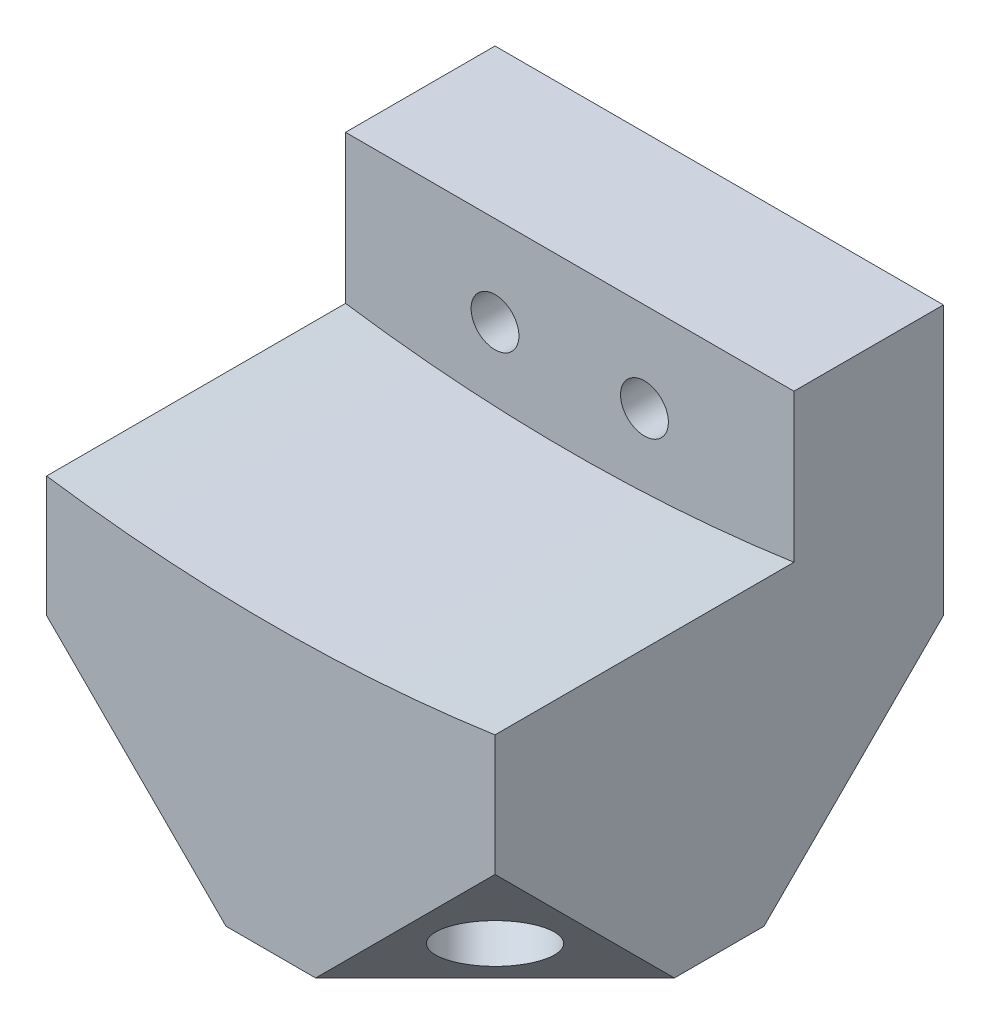
ISO-10303-21;
HEADER;
FILE_DESCRIPTION(('STEP AP214'),'2;1');
FILE_NAME('part.step','',(''),(''),'','','');
FILE_SCHEMA(('AUTOMOTIVE_DESIGN { 1 0 10303 214 1 1 1 1 }'));
ENDSEC;
DATA;
#1=APPLICATION_CONTEXT('core data for automotive mechanical design processes');
#2=APPLICATION_PROTOCOL_DEFINITION('international standard','automotive_design',2000,#1);
#3=PRODUCT_CONTEXT('',#1,'mechanical');
#4=PRODUCT('Part','Part','',(#3));
#5=PRODUCT_RELATED_PRODUCT_CATEGORY('part','',(#4));
#6=PRODUCT_DEFINITION_FORMATION('','',#4);
#7=PRODUCT_DEFINITION_CONTEXT('part definition',#1,'design');
#8=PRODUCT_DEFINITION('design','',#6,#7);
#9=PRODUCT_DEFINITION_SHAPE('','',#8);
#10=(LENGTH_UNIT() NAMED_UNIT(*) SI_UNIT(.MILLI.,.METRE.));
#11=(NAMED_UNIT(*) PLANE_ANGLE_UNIT() SI_UNIT($,.RADIAN.));
#12=(NAMED_UNIT(*) SI_UNIT($,.STERADIAN.) SOLID_ANGLE_UNIT());
#13=UNCERTAINTY_MEASURE_WITH_UNIT(LENGTH_MEASURE(1.E-05),#10,'distance_accuracy_value','');
#14=(GEOMETRIC_REPRESENTATION_CONTEXT(3) GLOBAL_UNCERTAINTY_ASSIGNED_CONTEXT((#13)) GLOBAL_UNIT_ASSIGNED_CONTEXT((#10,
#11,#12)) REPRESENTATION_CONTEXT('',''));
#15=CARTESIAN_POINT('',(0.,0.,0.));
#16=DIRECTION('',(0.,0.,1.));
#17=DIRECTION('',(1.,0.,0.));
#18=AXIS2_PLACEMENT_3D('',#15,#16,#17);
#19=CARTESIAN_POINT('',(-5.,9.,-25.));
#20=DIRECTION('',(0.,0.,1.));
#21=DIRECTION('',(1.,0.,0.));
#22=AXIS2_PLACEMENT_3D('',#19,#20,#21);
#23=CYLINDRICAL_SURFACE('',#22,1.6);
#24=CARTESIAN_POINT('',(-5.,9.,-5.));
#25=DIRECTION('',(0.,0.,1.));
#26=DIRECTION('',(1.,0.,0.));
#27=AXIS2_PLACEMENT_3D('',#24,#25,#26);
#28=CIRCLE('',#27,1.6);
#29=CARTESIAN_POINT('',(-3.4,9.,-5.));
#30=VERTEX_POINT('',#29);
#31=EDGE_CURVE('E293',#30,#30,#28,.T.);
#32=ORIENTED_EDGE('',*,*,#31,.T.);
#33=EDGE_LOOP('',(#32));
#34=FACE_BOUND('',#33,.T.);
#35=CARTESIAN_POINT('',(-5.,9.,-13.));
#36=DIRECTION('',(0.,0.,-1.));
#37=DIRECTION('',(-1.,0.,0.));
#38=AXIS2_PLACEMENT_3D('',#35,#36,#37);
#39=CIRCLE('',#38,1.6);
#40=CARTESIAN_POINT('',(-6.6,9.,-13.));
#41=VERTEX_POINT('',#40);
#42=EDGE_CURVE('E36',#41,#41,#39,.F.);
#43=ORIENTED_EDGE('',*,*,#42,.F.);
#44=EDGE_LOOP('',(#43));
#45=FACE_BOUND('',#44,.T.);
#46=ADVANCED_FACE('F32',(#34,#45),#23,.F.);
#47=CARTESIAN_POINT('',(5.,8.99999999999999,-25.));
#48=DIRECTION('',(0.,0.,1.));
#49=DIRECTION('',(1.,0.,0.));
#50=AXIS2_PLACEMENT_3D('',#47,#48,#49);
#51=CYLINDRICAL_SURFACE('',#50,1.6);
#52=CARTESIAN_POINT('',(5.,8.99999999999999,-5.));
#53=DIRECTION('',(0.,0.,1.));
#54=DIRECTION('',(1.,0.,0.));
#55=AXIS2_PLACEMENT_3D('',#52,#53,#54);
#56=CIRCLE('',#55,1.6);
#57=CARTESIAN_POINT('',(6.6,8.99999999999999,-5.));
#58=VERTEX_POINT('',#57);
#59=EDGE_CURVE('E290',#58,#58,#56,.T.);
#60=ORIENTED_EDGE('',*,*,#59,.T.);
#61=EDGE_LOOP('',(#60));
#62=FACE_BOUND('',#61,.T.);
#63=CARTESIAN_POINT('',(5.,8.99999999999999,-13.));
#64=DIRECTION('',(0.,0.,-1.));
#65=DIRECTION('',(-1.,0.,0.));
#66=AXIS2_PLACEMENT_3D('',#63,#64,#65);
#67=CIRCLE('',#66,1.6);
#68=CARTESIAN_POINT('',(3.4,8.99999999999999,-13.));
#69=VERTEX_POINT('',#68);
#70=EDGE_CURVE('E280',#69,#69,#67,.F.);
#71=ORIENTED_EDGE('',*,*,#70,.F.);
#72=EDGE_LOOP('',(#71));
#73=FACE_BOUND('',#72,.T.);
#74=ADVANCED_FACE('F399',(#62,#73),#51,.F.);
#75=CARTESIAN_POINT('',(-15.,15.,15.));
#76=DIRECTION('',(0.,-1.,0.));
#77=DIRECTION('',(0.,0.,-1.));
#78=AXIS2_PLACEMENT_3D('',#75,#76,#77);
#79=PLANE('',#78);
#80=DIRECTION('',(-1.,0.,0.));
#81=VECTOR('',#80,1.);
#82=CARTESIAN_POINT('',(-15.,15.,-5.));
#83=LINE('',#82,#81);
#84=CARTESIAN_POINT('',(15.,15.,-5.));
#85=VERTEX_POINT('',#84);
#86=CARTESIAN_POINT('',(-15.,15.,-5.));
#87=VERTEX_POINT('',#86);
#88=EDGE_CURVE('E307',#85,#87,#83,.T.);
#89=ORIENTED_EDGE('',*,*,#88,.F.);
#90=DIRECTION('',(0.,0.,-1.));
#91=VECTOR('',#90,1.);
#92=CARTESIAN_POINT('',(15.,15.,15.));
#93=LINE('',#92,#91);
#94=CARTESIAN_POINT('',(15.,15.,-15.));
#95=VERTEX_POINT('',#94);
#96=EDGE_CURVE('E351',#85,#95,#93,.T.);
#97=ORIENTED_EDGE('',*,*,#96,.T.);
#98=DIRECTION('',(-1.,0.,0.));
#99=VECTOR('',#98,1.);
#100=CARTESIAN_POINT('',(-15.,15.,-15.));
#101=LINE('',#100,#99);
#102=CARTESIAN_POINT('',(-15.,15.,-15.));
#103=VERTEX_POINT('',#102);
#104=EDGE_CURVE('E341',#95,#103,#101,.T.);
#105=ORIENTED_EDGE('',*,*,#104,.T.);
#106=DIRECTION('',(0.,0.,-1.));
#107=VECTOR('',#106,1.);
#108=CARTESIAN_POINT('',(-15.,15.,15.));
#109=LINE('',#108,#107);
#110=EDGE_CURVE('E349',#87,#103,#109,.T.);
#111=ORIENTED_EDGE('',*,*,#110,.F.);
#112=EDGE_LOOP('',(#89,#97,#105,#111));
#113=FACE_BOUND('',#112,.T.);
#114=ADVANCED_FACE('F401',(#113),#79,.F.);
#115=CARTESIAN_POINT('',(0.,0.,-15.));
#116=DIRECTION('',(0.,0.,-1.));
#117=DIRECTION('',(-1.,0.,0.));
#118=AXIS2_PLACEMENT_3D('',#115,#116,#117);
#119=PLANE('',#118);
#120=DIRECTION('',(0.499999999999997,0.866025403784441,0.));
#121=VECTOR('',#120,1.);
#122=CARTESIAN_POINT('',(-8.23316150746189,9.00000000000002,-15.));
#123=LINE('',#122,#121);
#124=CARTESIAN_POINT('',(-8.23316150746189,9.00000000000002,-15.));
#125=VERTEX_POINT('',#124);
#126=CARTESIAN_POINT('',(-6.61658075373095,11.8,-15.));
#127=VERTEX_POINT('',#126);
#128=EDGE_CURVE('E49',#125,#127,#123,.T.);
#129=ORIENTED_EDGE('',*,*,#128,.F.);
#130=DIRECTION('',(-0.500000000000003,0.866025403784437,0.));
#131=VECTOR('',#130,1.);
#132=CARTESIAN_POINT('',(-6.61658075373093,6.20000000000003,-15.));
#133=LINE('',#132,#131);
#134=CARTESIAN_POINT('',(-6.61658075373093,6.20000000000003,-15.));
#135=VERTEX_POINT('',#134);
#136=EDGE_CURVE('E210',#135,#125,#133,.T.);
#137=ORIENTED_EDGE('',*,*,#136,.F.);
#138=DIRECTION('',(-1.,0.,0.));
#139=VECTOR('',#138,1.);
#140=CARTESIAN_POINT('',(-3.38341924626904,6.2,-15.));
#141=LINE('',#140,#139);
#142=CARTESIAN_POINT('',(-3.38341924626904,6.2,-15.));
#143=VERTEX_POINT('',#142);
#144=EDGE_CURVE('E213',#143,#135,#141,.T.);
#145=ORIENTED_EDGE('',*,*,#144,.F.);
#146=DIRECTION('',(-0.499999999999996,-0.866025403784441,0.));
#147=VECTOR('',#146,1.);
#148=CARTESIAN_POINT('',(-1.7668384925381,9.00000000000001,-15.));
#149=LINE('',#148,#147);
#150=CARTESIAN_POINT('',(-1.7668384925381,9.00000000000001,-15.));
#151=VERTEX_POINT('',#150);
#152=EDGE_CURVE('E229',#151,#143,#149,.T.);
#153=ORIENTED_EDGE('',*,*,#152,.F.);
#154=DIRECTION('',(0.500000000000003,-0.866025403784437,0.));
#155=VECTOR('',#154,1.);
#156=CARTESIAN_POINT('',(-3.38341924626906,11.8,-15.));
#157=LINE('',#156,#155);
#158=CARTESIAN_POINT('',(-3.38341924626906,11.8,-15.));
#159=VERTEX_POINT('',#158);
#160=EDGE_CURVE('E226',#159,#151,#157,.T.);
#161=ORIENTED_EDGE('',*,*,#160,.F.);
#162=DIRECTION('',(1.,0.,0.));
#163=VECTOR('',#162,1.);
#164=CARTESIAN_POINT('',(-6.61658075373095,11.8,-15.));
#165=LINE('',#164,#163);
#166=EDGE_CURVE('E224',#127,#159,#165,.T.);
#167=ORIENTED_EDGE('',*,*,#166,.F.);
#168=EDGE_LOOP('',(#129,#137,#145,#153,#161,#167));
#169=FACE_BOUND('',#168,.T.);
#170=DIRECTION('',(0.500000000000003,0.866025403784437,0.));
#171=VECTOR('',#170,1.);
#172=CARTESIAN_POINT('',(1.76683849253808,9.00000000000004,-15.));
#173=LINE('',#172,#171);
#174=CARTESIAN_POINT('',(1.76683849253808,9.00000000000004,-15.));
#175=VERTEX_POINT('',#174);
#176=CARTESIAN_POINT('',(3.38341924626905,11.8,-15.));
#177=VERTEX_POINT('',#176);
#178=EDGE_CURVE('E57',#175,#177,#173,.T.);
#179=ORIENTED_EDGE('',*,*,#178,.F.);
#180=DIRECTION('',(-0.499999999999997,0.86602540378444,0.));
#181=VECTOR('',#180,1.);
#182=CARTESIAN_POINT('',(3.38341924626903,6.20000000000003,-15.));
#183=LINE('',#182,#181);
#184=CARTESIAN_POINT('',(3.38341924626903,6.20000000000003,-15.));
#185=VERTEX_POINT('',#184);
#186=EDGE_CURVE('E247',#185,#175,#183,.T.);
#187=ORIENTED_EDGE('',*,*,#186,.F.);
#188=DIRECTION('',(-1.,0.,0.));
#189=VECTOR('',#188,1.);
#190=CARTESIAN_POINT('',(6.61658075373094,6.19999999999999,-15.));
#191=LINE('',#190,#189);
#192=CARTESIAN_POINT('',(6.61658075373094,6.19999999999999,-15.));
#193=VERTEX_POINT('',#192);
#194=EDGE_CURVE('E273',#193,#185,#191,.T.);
#195=ORIENTED_EDGE('',*,*,#194,.F.);
#196=DIRECTION('',(-0.500000000000002,-0.866025403784437,0.));
#197=VECTOR('',#196,1.);
#198=CARTESIAN_POINT('',(8.2331615074619,8.99999999999999,-15.));
#199=LINE('',#198,#197);
#200=CARTESIAN_POINT('',(8.2331615074619,8.99999999999999,-15.));
#201=VERTEX_POINT('',#200);
#202=EDGE_CURVE('E270',#201,#193,#199,.T.);
#203=ORIENTED_EDGE('',*,*,#202,.F.);
#204=DIRECTION('',(0.499999999999997,-0.86602540378444,0.));
#205=VECTOR('',#204,1.);
#206=CARTESIAN_POINT('',(6.61658075373096,11.8,-15.));
#207=LINE('',#206,#205);
#208=CARTESIAN_POINT('',(6.61658075373096,11.8,-15.));
#209=VERTEX_POINT('',#208);
#210=EDGE_CURVE('E267',#209,#201,#207,.T.);
#211=ORIENTED_EDGE('',*,*,#210,.F.);
#212=DIRECTION('',(1.,0.,0.));
#213=VECTOR('',#212,1.);
#214=CARTESIAN_POINT('',(3.38341924626905,11.8,-15.));
#215=LINE('',#214,#213);
#216=EDGE_CURVE('E264',#177,#209,#215,.T.);
#217=ORIENTED_EDGE('',*,*,#216,.F.);
#218=EDGE_LOOP('',(#179,#187,#195,#203,#211,#217));
#219=FACE_BOUND('',#218,.T.);
#220=DIRECTION('',(1.,0.,0.));
#221=VECTOR('',#220,1.);
#222=CARTESIAN_POINT('',(-15.,-15.,-15.));
#223=LINE('',#222,#221);
#224=CARTESIAN_POINT('',(-2.99999999999999,-15.,-15.));
#225=VERTEX_POINT('',#224);
#226=CARTESIAN_POINT('',(3.00000000000001,-15.,-15.));
#227=VERTEX_POINT('',#226);
#228=EDGE_CURVE('E334',#225,#227,#223,.T.);
#229=ORIENTED_EDGE('',*,*,#228,.F.);
#230=DIRECTION('',(-0.707106781186547,0.707106781186547,0.));
#231=VECTOR('',#230,1.);
#232=CARTESIAN_POINT('',(-8.99999999999999,-8.99999999999999,-15.));
#233=LINE('',#232,#231);
#234=CARTESIAN_POINT('',(-15.,-2.99999999999999,-15.));
#235=VERTEX_POINT('',#234);
#236=EDGE_CURVE('E379',#225,#235,#233,.T.);
#237=ORIENTED_EDGE('',*,*,#236,.T.);
#238=DIRECTION('',(0.,-1.,0.));
#239=VECTOR('',#238,1.);
#240=CARTESIAN_POINT('',(-15.,-15.,-15.));
#241=LINE('',#240,#239);
#242=EDGE_CURVE('E344',#103,#235,#241,.T.);
#243=ORIENTED_EDGE('',*,*,#242,.F.);
#244=ORIENTED_EDGE('',*,*,#104,.F.);
#245=DIRECTION('',(0.,1.,0.));
#246=VECTOR('',#245,1.);
#247=CARTESIAN_POINT('',(15.,-15.,-15.));
#248=LINE('',#247,#246);
#249=CARTESIAN_POINT('',(15.,-3.,-15.));
#250=VERTEX_POINT('',#249);
#251=EDGE_CURVE('E327',#250,#95,#248,.T.);
#252=ORIENTED_EDGE('',*,*,#251,.F.);
#253=DIRECTION('',(-0.707106781186547,-0.707106781186547,0.));
#254=VECTOR('',#253,1.);
#255=CARTESIAN_POINT('',(9.,-9.,-15.));
#256=LINE('',#255,#254);
#257=EDGE_CURVE('E359',#250,#227,#256,.T.);
#258=ORIENTED_EDGE('',*,*,#257,.T.);
#259=EDGE_LOOP('',(#229,#237,#243,#244,#252,#258));
#260=FACE_BOUND('',#259,.T.);
#261=ADVANCED_FACE('F408',(#169,#219,#260),#119,.T.);
#262=CARTESIAN_POINT('',(11.,-11.,11.));
#263=DIRECTION('',(0.577350269189626,-0.577350269189626,0.577350269189626));
#264=DIRECTION('',(0.707106781186547,0.,-0.707106781186547));
#265=AXIS2_PLACEMENT_3D('',#262,#263,#264);
#266=PLANE('',#265);
#267=DIRECTION('',(0.707106781186547,0.,-0.707106781186547));
#268=VECTOR('',#267,1.);
#269=CARTESIAN_POINT('',(-5.99999999999999,-15.,24.));
#270=LINE('',#269,#268);
#271=CARTESIAN_POINT('',(3.,-15.,15.));
#272=VERTEX_POINT('',#271);
#273=CARTESIAN_POINT('',(15.,-15.,3.));
#274=VERTEX_POINT('',#273);
#275=EDGE_CURVE('E365',#272,#274,#270,.T.);
#276=ORIENTED_EDGE('',*,*,#275,.T.);
#277=DIRECTION('',(0.,0.707106781186547,0.707106781186547));
#278=VECTOR('',#277,1.);
#279=CARTESIAN_POINT('',(15.,-9.,9.));
#280=LINE('',#279,#278);
#281=CARTESIAN_POINT('',(15.,-2.99999999999999,15.));
#282=VERTEX_POINT('',#281);
#283=EDGE_CURVE('E362',#274,#282,#280,.T.);
#284=ORIENTED_EDGE('',*,*,#283,.T.);
#285=DIRECTION('',(-0.707106781186547,-0.707106781186547,0.));
#286=VECTOR('',#285,1.);
#287=CARTESIAN_POINT('',(9.,-9.,15.));
#288=LINE('',#287,#286);
#289=EDGE_CURVE('E368',#282,#272,#288,.T.);
#290=ORIENTED_EDGE('',*,*,#289,.T.);
#291=EDGE_LOOP('',(#276,#284,#290));
#292=FACE_BOUND('',#291,.T.);
#293=CARTESIAN_POINT('',(11.,-11.,11.));
#294=DIRECTION('',(-0.577350269189626,0.577350269189626,-0.577350269189626));
#295=DIRECTION('',(0.,0.707106781186548,0.707106781186548));
#296=AXIS2_PLACEMENT_3D('',#293,#294,#295);
#297=CIRCLE('',#296,3.25);
#298=CARTESIAN_POINT('',(11.,-8.70190296114373,13.2980970388563));
#299=VERTEX_POINT('',#298);
#300=EDGE_CURVE('E315',#299,#299,#297,.T.);
#301=ORIENTED_EDGE('',*,*,#300,.T.);
#302=EDGE_LOOP('',(#301));
#303=FACE_BOUND('',#302,.T.);
#304=ADVANCED_FACE('F458',(#292,#303),#266,.T.);
#305=CARTESIAN_POINT('',(15.,-15.,15.));
#306=DIRECTION('',(-1.,0.,0.));
#307=DIRECTION('',(0.,0.,1.));
#308=AXIS2_PLACEMENT_3D('',#305,#306,#307);
#309=PLANE('',#308);
#310=DIRECTION('',(0.,1.,0.));
#311=VECTOR('',#310,1.);
#312=CARTESIAN_POINT('',(15.,-15.,-5.));
#313=LINE('',#312,#311);
#314=CARTESIAN_POINT('',(15.,5.08741573548933,-5.));
#315=VERTEX_POINT('',#314);
#316=EDGE_CURVE('E309',#315,#85,#313,.T.);
#317=ORIENTED_EDGE('',*,*,#316,.F.);
#318=DIRECTION('',(0.,0.,1.));
#319=VECTOR('',#318,1.);
#320=CARTESIAN_POINT('',(15.,5.08741573548933,-5.));
#321=LINE('',#320,#319);
#322=CARTESIAN_POINT('',(15.,5.08741573548933,15.));
#323=VERTEX_POINT('',#322);
#324=EDGE_CURVE('E304',#315,#323,#321,.T.);
#325=ORIENTED_EDGE('',*,*,#324,.T.);
#326=DIRECTION('',(0.,1.,0.));
#327=VECTOR('',#326,1.);
#328=CARTESIAN_POINT('',(15.,-15.,15.));
#329=LINE('',#328,#327);
#330=EDGE_CURVE('E330',#282,#323,#329,.T.);
#331=ORIENTED_EDGE('',*,*,#330,.F.);
#332=ORIENTED_EDGE('',*,*,#283,.F.);
#333=DIRECTION('',(0.,0.,-1.));
#334=VECTOR('',#333,1.);
#335=CARTESIAN_POINT('',(15.,-15.,15.));
#336=LINE('',#335,#334);
#337=CARTESIAN_POINT('',(15.,-15.,-3.));
#338=VERTEX_POINT('',#337);
#339=EDGE_CURVE('E338',#274,#338,#336,.T.);
#340=ORIENTED_EDGE('',*,*,#339,.T.);
#341=DIRECTION('',(0.,-0.707106781186547,0.707106781186547));
#342=VECTOR('',#341,1.);
#343=CARTESIAN_POINT('',(15.,-24.,6.));
#344=LINE('',#343,#342);
#345=EDGE_CURVE('E353',#250,#338,#344,.T.);
#346=ORIENTED_EDGE('',*,*,#345,.F.);
#347=ORIENTED_EDGE('',*,*,#251,.T.);
#348=ORIENTED_EDGE('',*,*,#96,.F.);
#349=EDGE_LOOP('',(#317,#325,#331,#332,#340,#346,#347,#348));
#350=FACE_BOUND('',#349,.T.);
#351=ADVANCED_FACE('F461',(#350),#309,.F.);
#352=CARTESIAN_POINT('',(-15.,-15.,15.));
#353=DIRECTION('',(1.,0.,0.));
#354=DIRECTION('',(0.,0.,-1.));
#355=AXIS2_PLACEMENT_3D('',#352,#353,#354);
#356=PLANE('',#355);
#357=DIRECTION('',(0.,-1.,0.));
#358=VECTOR('',#357,1.);
#359=CARTESIAN_POINT('',(-15.,-15.,15.));
#360=LINE('',#359,#358);
#361=CARTESIAN_POINT('',(-15.,5.08741573548933,15.));
#362=VERTEX_POINT('',#361);
#363=CARTESIAN_POINT('',(-15.,-2.99999999999999,15.));
#364=VERTEX_POINT('',#363);
#365=EDGE_CURVE('E333',#362,#364,#360,.T.);
#366=ORIENTED_EDGE('',*,*,#365,.F.);
#367=DIRECTION('',(0.,0.,1.));
#368=VECTOR('',#367,1.);
#369=CARTESIAN_POINT('',(-15.,5.08741573548933,-5.));
#370=LINE('',#369,#368);
#371=CARTESIAN_POINT('',(-15.,5.08741573548933,-5.));
#372=VERTEX_POINT('',#371);
#373=EDGE_CURVE('E300',#362,#372,#370,.F.);
#374=ORIENTED_EDGE('',*,*,#373,.T.);
#375=DIRECTION('',(0.,-1.,0.));
#376=VECTOR('',#375,1.);
#377=CARTESIAN_POINT('',(-15.,-15.,-5.));
#378=LINE('',#377,#376);
#379=EDGE_CURVE('E11',#87,#372,#378,.T.);
#380=ORIENTED_EDGE('',*,*,#379,.F.);
#381=ORIENTED_EDGE('',*,*,#110,.T.);
#382=ORIENTED_EDGE('',*,*,#242,.T.);
#383=DIRECTION('',(0.,0.707106781186547,-0.707106781186547));
#384=VECTOR('',#383,1.);
#385=CARTESIAN_POINT('',(-15.,-24.,6.));
#386=LINE('',#385,#384);
#387=CARTESIAN_POINT('',(-15.,-6.99999999999997,-11.));
#388=VERTEX_POINT('',#387);
#389=EDGE_CURVE('E382',#388,#235,#386,.T.);
#390=ORIENTED_EDGE('',*,*,#389,.F.);
#391=DIRECTION('',(0.,0.,1.));
#392=VECTOR('',#391,1.);
#393=CARTESIAN_POINT('',(-15.,-6.99999999999997,15.));
#394=LINE('',#393,#392);
#395=CARTESIAN_POINT('',(-15.,-6.99999999999997,11.));
#396=VERTEX_POINT('',#395);
#397=EDGE_CURVE('E392',#388,#396,#394,.T.);
#398=ORIENTED_EDGE('',*,*,#397,.T.);
#399=DIRECTION('',(0.,-0.707106781186547,-0.707106781186547));
#400=VECTOR('',#399,1.);
#401=CARTESIAN_POINT('',(-15.,-9.,9.));
#402=LINE('',#401,#400);
#403=EDGE_CURVE('E371',#364,#396,#402,.T.);
#404=ORIENTED_EDGE('',*,*,#403,.F.);
#405=EDGE_LOOP('',(#366,#374,#380,#381,#382,#390,#398,#404));
#406=FACE_BOUND('',#405,.T.);
#407=ADVANCED_FACE('F476',(#406),#356,.F.);
#408=CARTESIAN_POINT('',(-15.,-15.,15.));
#409=DIRECTION('',(0.,1.,0.));
#410=DIRECTION('',(0.,0.,1.));
#411=AXIS2_PLACEMENT_3D('',#408,#409,#410);
#412=PLANE('',#411);
#413=DIRECTION('',(0.707106781186547,0.,0.707106781186547));
#414=VECTOR('',#413,1.);
#415=CARTESIAN_POINT('',(-8.99999999999999,-15.,9.));
#416=LINE('',#415,#414);
#417=CARTESIAN_POINT('',(-6.99999999999999,-15.,11.));
#418=VERTEX_POINT('',#417);
#419=CARTESIAN_POINT('',(-2.99999999999998,-15.,15.));
#420=VERTEX_POINT('',#419);
#421=EDGE_CURVE('E374',#418,#420,#416,.T.);
#422=ORIENTED_EDGE('',*,*,#421,.F.);
#423=DIRECTION('',(0.,0.,-1.));
#424=VECTOR('',#423,1.);
#425=CARTESIAN_POINT('',(-6.99999999999999,-15.,15.));
#426=LINE('',#425,#424);
#427=CARTESIAN_POINT('',(-6.99999999999998,-15.,-11.));
#428=VERTEX_POINT('',#427);
#429=EDGE_CURVE('E387',#418,#428,#426,.T.);
#430=ORIENTED_EDGE('',*,*,#429,.T.);
#431=DIRECTION('',(-0.707106781186547,0.,0.707106781186547));
#432=VECTOR('',#431,1.);
#433=CARTESIAN_POINT('',(-24.,-15.,6.));
#434=LINE('',#433,#432);
#435=EDGE_CURVE('E384',#225,#428,#434,.T.);
#436=ORIENTED_EDGE('',*,*,#435,.F.);
#437=ORIENTED_EDGE('',*,*,#228,.T.);
#438=DIRECTION('',(-0.707106781186547,0.,-0.707106781186547));
#439=VECTOR('',#438,1.);
#440=CARTESIAN_POINT('',(9.,-15.,-9.));
#441=LINE('',#440,#439);
#442=EDGE_CURVE('E356',#338,#227,#441,.T.);
#443=ORIENTED_EDGE('',*,*,#442,.F.);
#444=ORIENTED_EDGE('',*,*,#339,.F.);
#445=ORIENTED_EDGE('',*,*,#275,.F.);
#446=DIRECTION('',(1.,0.,0.));
#447=VECTOR('',#446,1.);
#448=CARTESIAN_POINT('',(-15.,-15.,15.));
#449=LINE('',#448,#447);
#450=EDGE_CURVE('E336',#420,#272,#449,.T.);
#451=ORIENTED_EDGE('',*,*,#450,.F.);
#452=EDGE_LOOP('',(#422,#430,#436,#437,#443,#444,#445,#451));
#453=FACE_BOUND('',#452,.T.);
#454=ADVANCED_FACE('F469',(#453),#412,.F.);
#455=CARTESIAN_POINT('',(0.,0.,15.));
#456=DIRECTION('',(0.,0.,-1.));
#457=DIRECTION('',(-1.,0.,0.));
#458=AXIS2_PLACEMENT_3D('',#455,#456,#457);
#459=PLANE('',#458);
#460=ORIENTED_EDGE('',*,*,#330,.T.);
#461=CARTESIAN_POINT('',(0.,108.,15.));
#462=DIRECTION('',(0.,0.,1.));
#463=DIRECTION('',(1.,0.,0.));
#464=AXIS2_PLACEMENT_3D('',#461,#462,#463);
#465=CIRCLE('',#464,104.);
#466=EDGE_CURVE('E296',#362,#323,#465,.T.);
#467=ORIENTED_EDGE('',*,*,#466,.F.);
#468=ORIENTED_EDGE('',*,*,#365,.T.);
#469=DIRECTION('',(-0.707106781186547,0.707106781186547,0.));
#470=VECTOR('',#469,1.);
#471=CARTESIAN_POINT('',(-8.99999999999999,-8.99999999999999,15.));
#472=LINE('',#471,#470);
#473=EDGE_CURVE('E376',#420,#364,#472,.T.);
#474=ORIENTED_EDGE('',*,*,#473,.F.);
#475=ORIENTED_EDGE('',*,*,#450,.T.);
#476=ORIENTED_EDGE('',*,*,#289,.F.);
#477=EDGE_LOOP('',(#460,#467,#468,#474,#475,#476));
#478=FACE_BOUND('',#477,.T.);
#479=ADVANCED_FACE('F465',(#478),#459,.F.);
#480=CARTESIAN_POINT('',(11.,-11.,-11.));
#481=DIRECTION('',(0.577350269189626,-0.577350269189626,-0.577350269189626));
#482=DIRECTION('',(-0.707106781186547,0.,-0.707106781186547));
#483=AXIS2_PLACEMENT_3D('',#480,#481,#482);
#484=PLANE('',#483);
#485=CARTESIAN_POINT('',(11.,-11.,-11.));
#486=DIRECTION('',(0.577350269189626,-0.577350269189626,-0.577350269189626));
#487=DIRECTION('',(0.,0.707106781186548,-0.707106781186548));
#488=AXIS2_PLACEMENT_3D('',#485,#486,#487);
#489=CIRCLE('',#488,3.25);
#490=CARTESIAN_POINT('',(11.,-8.70190296114373,-13.2980970388563));
#491=VERTEX_POINT('',#490);
#492=EDGE_CURVE('E321',#491,#491,#489,.T.);
#493=ORIENTED_EDGE('',*,*,#492,.F.);
#494=EDGE_LOOP('',(#493));
#495=FACE_BOUND('',#494,.T.);
#496=ORIENTED_EDGE('',*,*,#257,.F.);
#497=ORIENTED_EDGE('',*,*,#345,.T.);
#498=ORIENTED_EDGE('',*,*,#442,.T.);
#499=EDGE_LOOP('',(#496,#497,#498));
#500=FACE_BOUND('',#499,.T.);
#501=ADVANCED_FACE('F456',(#495,#500),#484,.T.);
#502=CARTESIAN_POINT('',(5.22649730810374,-5.22649730810374,-5.22649730810374));
#503=DIRECTION('',(0.577350269189626,-0.577350269189626,-0.577350269189626));
#504=DIRECTION('',(0.,0.707106781186548,-0.707106781186548));
#505=AXIS2_PLACEMENT_3D('',#502,#503,#504);
#506=CYLINDRICAL_SURFACE('',#505,3.25);
#507=CARTESIAN_POINT('',(5.22649730810374,-5.22649730810374,-5.22649730810374));
#508=DIRECTION('',(0.577350269189626,-0.577350269189626,-0.577350269189626));
#509=DIRECTION('',(0.,0.707106781186548,-0.707106781186548));
#510=AXIS2_PLACEMENT_3D('',#507,#508,#509);
#511=CIRCLE('',#510,3.25);
#512=CARTESIAN_POINT('',(5.22649730810374,-2.92840026924746,-7.52459434696002));
#513=VERTEX_POINT('',#512);
#514=EDGE_CURVE('E324',#513,#513,#511,.T.);
#515=ORIENTED_EDGE('',*,*,#514,.F.);
#516=EDGE_LOOP('',(#515));
#517=FACE_BOUND('',#516,.T.);
#518=ORIENTED_EDGE('',*,*,#492,.T.);
#519=EDGE_LOOP('',(#518));
#520=FACE_BOUND('',#519,.T.);
#521=ADVANCED_FACE('F452',(#517,#520),#506,.F.);
#522=CARTESIAN_POINT('',(5.22649730810374,-5.22649730810374,-5.22649730810374));
#523=DIRECTION('',(0.577350269189626,-0.577350269189626,-0.577350269189626));
#524=DIRECTION('',(0.,0.707106781186548,-0.707106781186548));
#525=AXIS2_PLACEMENT_3D('',#522,#523,#524);
#526=PLANE('',#525);
#527=ORIENTED_EDGE('',*,*,#514,.T.);
#528=EDGE_LOOP('',(#527));
#529=FACE_BOUND('',#528,.T.);
#530=ADVANCED_FACE('F448',(#529),#526,.T.);
#531=CARTESIAN_POINT('',(5.22649730810374,-5.22649730810374,5.22649730810374));
#532=DIRECTION('',(0.577350269189626,-0.577350269189626,0.577350269189626));
#533=DIRECTION('',(0.,-0.707106781186548,-0.707106781186548));
#534=AXIS2_PLACEMENT_3D('',#531,#532,#533);
#535=CYLINDRICAL_SURFACE('',#534,3.25);
#536=CARTESIAN_POINT('',(5.22649730810374,-5.22649730810374,5.22649730810374));
#537=DIRECTION('',(-0.577350269189626,0.577350269189626,-0.577350269189626));
#538=DIRECTION('',(0.,0.707106781186548,0.707106781186548));
#539=AXIS2_PLACEMENT_3D('',#536,#537,#538);
#540=CIRCLE('',#539,3.25);
#541=CARTESIAN_POINT('',(5.22649730810374,-2.92840026924746,7.52459434696002));
#542=VERTEX_POINT('',#541);
#543=EDGE_CURVE('E318',#542,#542,#540,.T.);
#544=ORIENTED_EDGE('',*,*,#543,.T.);
#545=EDGE_LOOP('',(#544));
#546=FACE_BOUND('',#545,.T.);
#547=ORIENTED_EDGE('',*,*,#300,.F.);
#548=EDGE_LOOP('',(#547));
#549=FACE_BOUND('',#548,.T.);
#550=ADVANCED_FACE('F444',(#546,#549),#535,.F.);
#551=CARTESIAN_POINT('',(5.22649730810374,-5.22649730810374,5.22649730810374));
#552=DIRECTION('',(0.577350269189626,-0.577350269189626,0.577350269189626));
#553=DIRECTION('',(0.,0.707106781186548,0.707106781186548));
#554=AXIS2_PLACEMENT_3D('',#551,#552,#553);
#555=PLANE('',#554);
#556=ORIENTED_EDGE('',*,*,#543,.F.);
#557=EDGE_LOOP('',(#556));
#558=FACE_BOUND('',#557,.T.);
#559=ADVANCED_FACE('F440',(#558),#555,.T.);
#560=CARTESIAN_POINT('',(-11.,-11.,11.));
#561=DIRECTION('',(-0.577350269189626,-0.577350269189626,0.577350269189626));
#562=DIRECTION('',(0.707106781186547,0.,0.707106781186547));
#563=AXIS2_PLACEMENT_3D('',#560,#561,#562);
#564=PLANE('',#563);
#565=ORIENTED_EDGE('',*,*,#403,.T.);
#566=DIRECTION('',(-0.707106781186546,0.707106781186549,0.));
#567=VECTOR('',#566,1.);
#568=CARTESIAN_POINT('',(-11.,-11.,11.));
#569=LINE('',#568,#567);
#570=EDGE_CURVE('E41',#396,#418,#569,.F.);
#571=ORIENTED_EDGE('',*,*,#570,.T.);
#572=ORIENTED_EDGE('',*,*,#421,.T.);
#573=ORIENTED_EDGE('',*,*,#473,.T.);
#574=EDGE_LOOP('',(#565,#571,#572,#573));
#575=FACE_BOUND('',#574,.T.);
#576=ADVANCED_FACE('F436',(#575),#564,.T.);
#577=CARTESIAN_POINT('',(-11.,-11.,-11.));
#578=DIRECTION('',(-0.577350269189626,-0.577350269189626,-0.577350269189626));
#579=DIRECTION('',(-0.707106781186547,0.,0.707106781186547));
#580=AXIS2_PLACEMENT_3D('',#577,#578,#579);
#581=PLANE('',#580);
#582=ORIENTED_EDGE('',*,*,#435,.T.);
#583=DIRECTION('',(0.707106781186546,-0.707106781186549,0.));
#584=VECTOR('',#583,1.);
#585=CARTESIAN_POINT('',(-11.,-11.,-11.));
#586=LINE('',#585,#584);
#587=EDGE_CURVE('E390',#428,#388,#586,.F.);
#588=ORIENTED_EDGE('',*,*,#587,.T.);
#589=ORIENTED_EDGE('',*,*,#389,.T.);
#590=ORIENTED_EDGE('',*,*,#236,.F.);
#591=EDGE_LOOP('',(#582,#588,#589,#590));
#592=FACE_BOUND('',#591,.T.);
#593=ADVANCED_FACE('F433',(#592),#581,.T.);
#594=CARTESIAN_POINT('',(-6.99999999999999,-15.,15.));
#595=DIRECTION('',(0.707106781186549,0.707106781186546,0.));
#596=DIRECTION('',(0.,0.,-1.));
#597=AXIS2_PLACEMENT_3D('',#594,#595,#596);
#598=PLANE('',#597);
#599=CARTESIAN_POINT('',(-11.,-11.,0.));
#600=DIRECTION('',(-0.707106781186549,-0.707106781186546,0.));
#601=DIRECTION('',(0.707106781186546,-0.707106781186549,0.));
#602=AXIS2_PLACEMENT_3D('',#599,#600,#601);
#603=CIRCLE('',#602,3.25);
#604=CARTESIAN_POINT('',(-8.70190296114373,-13.2980970388563,0.));
#605=VERTEX_POINT('',#604);
#606=EDGE_CURVE('E311',#605,#605,#603,.T.);
#607=ORIENTED_EDGE('',*,*,#606,.F.);
#608=EDGE_LOOP('',(#607));
#609=FACE_BOUND('',#608,.T.);
#610=ORIENTED_EDGE('',*,*,#570,.F.);
#611=ORIENTED_EDGE('',*,*,#397,.F.);
#612=ORIENTED_EDGE('',*,*,#587,.F.);
#613=ORIENTED_EDGE('',*,*,#429,.F.);
#614=EDGE_LOOP('',(#610,#611,#612,#613));
#615=FACE_BOUND('',#614,.T.);
#616=ADVANCED_FACE('F34',(#609,#615),#598,.F.);
#617=CARTESIAN_POINT('',(-3.92893218813452,-3.92893218813451,0.));
#618=DIRECTION('',(-0.707106781186549,-0.707106781186546,0.));
#619=DIRECTION('',(0.707106781186546,-0.707106781186549,0.));
#620=AXIS2_PLACEMENT_3D('',#617,#618,#619);
#621=CYLINDRICAL_SURFACE('',#620,3.25);
#622=CARTESIAN_POINT('',(-3.92893218813452,-3.92893218813451,0.));
#623=DIRECTION('',(-0.707106781186549,-0.707106781186546,0.));
#624=DIRECTION('',(0.707106781186546,-0.707106781186549,0.));
#625=AXIS2_PLACEMENT_3D('',#622,#623,#624);
#626=CIRCLE('',#625,3.25);
#627=CARTESIAN_POINT('',(-1.63083514927825,-6.22702922699079,0.));
#628=VERTEX_POINT('',#627);
#629=EDGE_CURVE('E312',#628,#628,#626,.T.);
#630=ORIENTED_EDGE('',*,*,#629,.F.);
#631=EDGE_LOOP('',(#630));
#632=FACE_BOUND('',#631,.T.);
#633=ORIENTED_EDGE('',*,*,#606,.T.);
#634=EDGE_LOOP('',(#633));
#635=FACE_BOUND('',#634,.T.);
#636=ADVANCED_FACE('F428',(#632,#635),#621,.F.);
#637=CARTESIAN_POINT('',(-3.92893218813452,-3.92893218813451,0.));
#638=DIRECTION('',(-0.707106781186549,-0.707106781186546,0.));
#639=DIRECTION('',(0.707106781186546,-0.707106781186549,0.));
#640=AXIS2_PLACEMENT_3D('',#637,#638,#639);
#641=PLANE('',#640);
#642=ORIENTED_EDGE('',*,*,#629,.T.);
#643=EDGE_LOOP('',(#642));
#644=FACE_BOUND('',#643,.T.);
#645=ADVANCED_FACE('F421',(#644),#641,.T.);
#646=CARTESIAN_POINT('',(0.,108.,-5.));
#647=DIRECTION('',(0.,0.,1.));
#648=DIRECTION('',(1.,0.,0.));
#649=AXIS2_PLACEMENT_3D('',#646,#647,#648);
#650=PLANE('',#649);
#651=ORIENTED_EDGE('',*,*,#59,.F.);
#652=EDGE_LOOP('',(#651));
#653=FACE_BOUND('',#652,.T.);
#654=ORIENTED_EDGE('',*,*,#31,.F.);
#655=EDGE_LOOP('',(#654));
#656=FACE_BOUND('',#655,.T.);
#657=ORIENTED_EDGE('',*,*,#316,.T.);
#658=ORIENTED_EDGE('',*,*,#88,.T.);
#659=ORIENTED_EDGE('',*,*,#379,.T.);
#660=CARTESIAN_POINT('',(0.,108.,-5.));
#661=DIRECTION('',(0.,0.,1.));
#662=DIRECTION('',(1.,0.,0.));
#663=AXIS2_PLACEMENT_3D('',#660,#661,#662);
#664=CIRCLE('',#663,104.);
#665=EDGE_CURVE('E297',#372,#315,#664,.T.);
#666=ORIENTED_EDGE('',*,*,#665,.T.);
#667=EDGE_LOOP('',(#657,#658,#659,#666));
#668=FACE_BOUND('',#667,.T.);
#669=ADVANCED_FACE('F417',(#653,#656,#668),#650,.T.);
#670=CARTESIAN_POINT('',(0.,108.,-5.));
#671=DIRECTION('',(0.,0.,1.));
#672=DIRECTION('',(1.,0.,0.));
#673=AXIS2_PLACEMENT_3D('',#670,#671,#672);
#674=CYLINDRICAL_SURFACE('',#673,104.);
#675=ORIENTED_EDGE('',*,*,#665,.F.);
#676=ORIENTED_EDGE('',*,*,#373,.F.);
#677=ORIENTED_EDGE('',*,*,#466,.T.);
#678=ORIENTED_EDGE('',*,*,#324,.F.);
#679=EDGE_LOOP('',(#675,#676,#677,#678));
#680=FACE_BOUND('',#679,.T.);
#681=ADVANCED_FACE('F420',(#680),#674,.F.);
#682=CARTESIAN_POINT('',(0.,0.,-13.));
#683=DIRECTION('',(0.,0.,-1.));
#684=DIRECTION('',(-1.,0.,0.));
#685=AXIS2_PLACEMENT_3D('',#682,#683,#684);
#686=PLANE('',#685);
#687=DIRECTION('',(0.500000000000003,0.866025403784437,0.));
#688=VECTOR('',#687,1.);
#689=CARTESIAN_POINT('',(1.76683849253808,9.00000000000004,-13.));
#690=LINE('',#689,#688);
#691=CARTESIAN_POINT('',(1.76683849253808,9.00000000000004,-13.));
#692=VERTEX_POINT('',#691);
#693=CARTESIAN_POINT('',(3.38341924626905,11.8,-13.));
#694=VERTEX_POINT('',#693);
#695=EDGE_CURVE('E243',#692,#694,#690,.T.);
#696=ORIENTED_EDGE('',*,*,#695,.T.);
#697=DIRECTION('',(1.,0.,0.));
#698=VECTOR('',#697,1.);
#699=CARTESIAN_POINT('',(3.38341924626905,11.8,-13.));
#700=LINE('',#699,#698);
#701=CARTESIAN_POINT('',(6.61658075373096,11.8,-13.));
#702=VERTEX_POINT('',#701);
#703=EDGE_CURVE('E246',#694,#702,#700,.T.);
#704=ORIENTED_EDGE('',*,*,#703,.T.);
#705=DIRECTION('',(0.499999999999997,-0.86602540378444,0.));
#706=VECTOR('',#705,1.);
#707=CARTESIAN_POINT('',(6.61658075373096,11.8,-13.));
#708=LINE('',#707,#706);
#709=CARTESIAN_POINT('',(8.2331615074619,8.99999999999999,-13.));
#710=VERTEX_POINT('',#709);
#711=EDGE_CURVE('E250',#702,#710,#708,.T.);
#712=ORIENTED_EDGE('',*,*,#711,.T.);
#713=DIRECTION('',(-0.500000000000002,-0.866025403784437,0.));
#714=VECTOR('',#713,1.);
#715=CARTESIAN_POINT('',(8.2331615074619,8.99999999999999,-13.));
#716=LINE('',#715,#714);
#717=CARTESIAN_POINT('',(6.61658075373094,6.19999999999999,-13.));
#718=VERTEX_POINT('',#717);
#719=EDGE_CURVE('E253',#710,#718,#716,.T.);
#720=ORIENTED_EDGE('',*,*,#719,.T.);
#721=DIRECTION('',(-1.,0.,0.));
#722=VECTOR('',#721,1.);
#723=CARTESIAN_POINT('',(6.61658075373094,6.19999999999999,-13.));
#724=LINE('',#723,#722);
#725=CARTESIAN_POINT('',(3.38341924626903,6.20000000000003,-13.));
#726=VERTEX_POINT('',#725);
#727=EDGE_CURVE('E256',#718,#726,#724,.T.);
#728=ORIENTED_EDGE('',*,*,#727,.T.);
#729=DIRECTION('',(-0.499999999999997,0.86602540378444,0.));
#730=VECTOR('',#729,1.);
#731=CARTESIAN_POINT('',(3.38341924626903,6.20000000000003,-13.));
#732=LINE('',#731,#730);
#733=EDGE_CURVE('E259',#726,#692,#732,.T.);
#734=ORIENTED_EDGE('',*,*,#733,.T.);
#735=EDGE_LOOP('',(#696,#704,#712,#720,#728,#734));
#736=FACE_BOUND('',#735,.T.);
#737=ORIENTED_EDGE('',*,*,#70,.T.);
#738=EDGE_LOOP('',(#737));
#739=FACE_BOUND('',#738,.T.);
#740=ADVANCED_FACE('F397',(#736,#739),#686,.T.);
#741=CARTESIAN_POINT('',(1.76683849253808,9.00000000000004,-13.));
#742=DIRECTION('',(-0.866025403784437,0.500000000000003,0.));
#743=DIRECTION('',(-0.500000000000003,-0.866025403784437,0.));
#744=AXIS2_PLACEMENT_3D('',#741,#742,#743);
#745=PLANE('',#744);
#746=ORIENTED_EDGE('',*,*,#178,.T.);
#747=DIRECTION('',(0.,0.,-1.));
#748=VECTOR('',#747,1.);
#749=CARTESIAN_POINT('',(3.38341924626905,11.8,-13.));
#750=LINE('',#749,#748);
#751=EDGE_CURVE('E262',#694,#177,#750,.T.);
#752=ORIENTED_EDGE('',*,*,#751,.F.);
#753=ORIENTED_EDGE('',*,*,#695,.F.);
#754=DIRECTION('',(0.,0.,-1.));
#755=VECTOR('',#754,1.);
#756=CARTESIAN_POINT('',(1.76683849253808,9.00000000000004,-13.));
#757=LINE('',#756,#755);
#758=EDGE_CURVE('E278',#692,#175,#757,.T.);
#759=ORIENTED_EDGE('',*,*,#758,.T.);
#760=EDGE_LOOP('',(#746,#752,#753,#759));
#761=FACE_BOUND('',#760,.T.);
#762=ADVANCED_FACE('F414',(#761),#745,.F.);
#763=CARTESIAN_POINT('',(3.38341924626903,6.20000000000003,-13.));
#764=DIRECTION('',(-0.86602540378444,-0.499999999999997,0.));
#765=DIRECTION('',(0.499999999999997,-0.86602540378444,0.));
#766=AXIS2_PLACEMENT_3D('',#763,#764,#765);
#767=PLANE('',#766);
#768=ORIENTED_EDGE('',*,*,#186,.T.);
#769=ORIENTED_EDGE('',*,*,#758,.F.);
#770=ORIENTED_EDGE('',*,*,#733,.F.);
#771=DIRECTION('',(0.,0.,-1.));
#772=VECTOR('',#771,1.);
#773=CARTESIAN_POINT('',(3.38341924626903,6.20000000000003,-13.));
#774=LINE('',#773,#772);
#775=EDGE_CURVE('E281',#726,#185,#774,.T.);
#776=ORIENTED_EDGE('',*,*,#775,.T.);
#777=EDGE_LOOP('',(#768,#769,#770,#776));
#778=FACE_BOUND('',#777,.T.);
#779=ADVANCED_FACE('F556',(#778),#767,.F.);
#780=CARTESIAN_POINT('',(6.61658075373094,6.19999999999999,-13.));
#781=DIRECTION('',(0.,-1.,0.));
#782=DIRECTION('',(1.,0.,0.));
#783=AXIS2_PLACEMENT_3D('',#780,#781,#782);
#784=PLANE('',#783);
#785=ORIENTED_EDGE('',*,*,#194,.T.);
#786=ORIENTED_EDGE('',*,*,#775,.F.);
#787=ORIENTED_EDGE('',*,*,#727,.F.);
#788=DIRECTION('',(0.,0.,-1.));
#789=VECTOR('',#788,1.);
#790=CARTESIAN_POINT('',(6.61658075373094,6.19999999999999,-13.));
#791=LINE('',#790,#789);
#792=EDGE_CURVE('E283',#718,#193,#791,.T.);
#793=ORIENTED_EDGE('',*,*,#792,.T.);
#794=EDGE_LOOP('',(#785,#786,#787,#793));
#795=FACE_BOUND('',#794,.T.);
#796=ADVANCED_FACE('F562',(#795),#784,.F.);
#797=CARTESIAN_POINT('',(8.2331615074619,8.99999999999999,-13.));
#798=DIRECTION('',(0.866025403784437,-0.500000000000003,0.));
#799=DIRECTION('',(0.500000000000003,0.866025403784437,0.));
#800=AXIS2_PLACEMENT_3D('',#797,#798,#799);
#801=PLANE('',#800);
#802=ORIENTED_EDGE('',*,*,#202,.T.);
#803=ORIENTED_EDGE('',*,*,#792,.F.);
#804=ORIENTED_EDGE('',*,*,#719,.F.);
#805=DIRECTION('',(0.,0.,-1.));
#806=VECTOR('',#805,1.);
#807=CARTESIAN_POINT('',(8.2331615074619,8.99999999999999,-13.));
#808=LINE('',#807,#806);
#809=EDGE_CURVE('E285',#710,#201,#808,.T.);
#810=ORIENTED_EDGE('',*,*,#809,.T.);
#811=EDGE_LOOP('',(#802,#803,#804,#810));
#812=FACE_BOUND('',#811,.T.);
#813=ADVANCED_FACE('F570',(#812),#801,.F.);
#814=CARTESIAN_POINT('',(6.61658075373096,11.8,-13.));
#815=DIRECTION('',(0.86602540378444,0.499999999999997,0.));
#816=DIRECTION('',(-0.499999999999997,0.86602540378444,0.));
#817=AXIS2_PLACEMENT_3D('',#814,#815,#816);
#818=PLANE('',#817);
#819=ORIENTED_EDGE('',*,*,#210,.T.);
#820=ORIENTED_EDGE('',*,*,#809,.F.);
#821=ORIENTED_EDGE('',*,*,#711,.F.);
#822=DIRECTION('',(0.,0.,-1.));
#823=VECTOR('',#822,1.);
#824=CARTESIAN_POINT('',(6.61658075373096,11.8,-13.));
#825=LINE('',#824,#823);
#826=EDGE_CURVE('E287',#702,#209,#825,.T.);
#827=ORIENTED_EDGE('',*,*,#826,.T.);
#828=EDGE_LOOP('',(#819,#820,#821,#827));
#829=FACE_BOUND('',#828,.T.);
#830=ADVANCED_FACE('F578',(#829),#818,.F.);
#831=CARTESIAN_POINT('',(3.38341924626905,11.8,-13.));
#832=DIRECTION('',(0.,1.,0.));
#833=DIRECTION('',(-1.,0.,0.));
#834=AXIS2_PLACEMENT_3D('',#831,#832,#833);
#835=PLANE('',#834);
#836=ORIENTED_EDGE('',*,*,#216,.T.);
#837=ORIENTED_EDGE('',*,*,#826,.F.);
#838=ORIENTED_EDGE('',*,*,#703,.F.);
#839=ORIENTED_EDGE('',*,*,#751,.T.);
#840=EDGE_LOOP('',(#836,#837,#838,#839));
#841=FACE_BOUND('',#840,.T.);
#842=ADVANCED_FACE('F586',(#841),#835,.F.);
#843=CARTESIAN_POINT('',(0.,0.,-13.));
#844=DIRECTION('',(0.,0.,-1.));
#845=DIRECTION('',(-1.,0.,0.));
#846=AXIS2_PLACEMENT_3D('',#843,#844,#845);
#847=PLANE('',#846);
#848=DIRECTION('',(0.499999999999997,0.866025403784441,0.));
#849=VECTOR('',#848,1.);
#850=CARTESIAN_POINT('',(-8.23316150746189,9.00000000000002,-13.));
#851=LINE('',#850,#849);
#852=CARTESIAN_POINT('',(-8.23316150746189,9.00000000000002,-13.));
#853=VERTEX_POINT('',#852);
#854=CARTESIAN_POINT('',(-6.61658075373095,11.8,-13.));
#855=VERTEX_POINT('',#854);
#856=EDGE_CURVE('E190',#853,#855,#851,.T.);
#857=ORIENTED_EDGE('',*,*,#856,.T.);
#858=DIRECTION('',(1.,0.,0.));
#859=VECTOR('',#858,1.);
#860=CARTESIAN_POINT('',(-6.61658075373095,11.8,-13.));
#861=LINE('',#860,#859);
#862=CARTESIAN_POINT('',(-3.38341924626906,11.8,-13.));
#863=VERTEX_POINT('',#862);
#864=EDGE_CURVE('E199',#855,#863,#861,.T.);
#865=ORIENTED_EDGE('',*,*,#864,.T.);
#866=DIRECTION('',(0.500000000000003,-0.866025403784437,0.));
#867=VECTOR('',#866,1.);
#868=CARTESIAN_POINT('',(-3.38341924626906,11.8,-13.));
#869=LINE('',#868,#867);
#870=CARTESIAN_POINT('',(-1.7668384925381,9.00000000000001,-13.));
#871=VERTEX_POINT('',#870);
#872=EDGE_CURVE('E204',#863,#871,#869,.T.);
#873=ORIENTED_EDGE('',*,*,#872,.T.);
#874=DIRECTION('',(-0.499999999999996,-0.866025403784441,0.));
#875=VECTOR('',#874,1.);
#876=CARTESIAN_POINT('',(-1.7668384925381,9.00000000000001,-13.));
#877=LINE('',#876,#875);
#878=CARTESIAN_POINT('',(-3.38341924626904,6.2,-13.));
#879=VERTEX_POINT('',#878);
#880=EDGE_CURVE('E217',#871,#879,#877,.T.);
#881=ORIENTED_EDGE('',*,*,#880,.T.);
#882=DIRECTION('',(-1.,0.,0.));
#883=VECTOR('',#882,1.);
#884=CARTESIAN_POINT('',(-3.38341924626904,6.2,-13.));
#885=LINE('',#884,#883);
#886=CARTESIAN_POINT('',(-6.61658075373093,6.20000000000003,-13.));
#887=VERTEX_POINT('',#886);
#888=EDGE_CURVE('E220',#879,#887,#885,.T.);
#889=ORIENTED_EDGE('',*,*,#888,.T.);
#890=DIRECTION('',(-0.500000000000003,0.866025403784437,0.));
#891=VECTOR('',#890,1.);
#892=CARTESIAN_POINT('',(-6.61658075373093,6.20000000000003,-13.));
#893=LINE('',#892,#891);
#894=EDGE_CURVE('E196',#887,#853,#893,.T.);
#895=ORIENTED_EDGE('',*,*,#894,.T.);
#896=EDGE_LOOP('',(#857,#865,#873,#881,#889,#895));
#897=FACE_BOUND('',#896,.T.);
#898=ORIENTED_EDGE('',*,*,#42,.T.);
#899=EDGE_LOOP('',(#898));
#900=FACE_BOUND('',#899,.T.);
#901=ADVANCED_FACE('F206',(#897,#900),#847,.T.);
#902=CARTESIAN_POINT('',(-8.23316150746189,9.00000000000002,-13.));
#903=DIRECTION('',(-0.866025403784441,0.499999999999997,0.));
#904=DIRECTION('',(-0.499999999999997,-0.866025403784441,0.));
#905=AXIS2_PLACEMENT_3D('',#902,#903,#904);
#906=PLANE('',#905);
#907=ORIENTED_EDGE('',*,*,#128,.T.);
#908=DIRECTION('',(0.,0.,-1.));
#909=VECTOR('',#908,1.);
#910=CARTESIAN_POINT('',(-6.61658075373095,11.8,-13.));
#911=LINE('',#910,#909);
#912=EDGE_CURVE('E186',#855,#127,#911,.T.);
#913=ORIENTED_EDGE('',*,*,#912,.F.);
#914=ORIENTED_EDGE('',*,*,#856,.F.);
#915=DIRECTION('',(0.,0.,-1.));
#916=VECTOR('',#915,1.);
#917=CARTESIAN_POINT('',(-8.23316150746189,9.00000000000002,-13.));
#918=LINE('',#917,#916);
#919=EDGE_CURVE('E234',#853,#125,#918,.T.);
#920=ORIENTED_EDGE('',*,*,#919,.T.);
#921=EDGE_LOOP('',(#907,#913,#914,#920));
#922=FACE_BOUND('',#921,.T.);
#923=ADVANCED_FACE('F188',(#922),#906,.F.);
#924=CARTESIAN_POINT('',(-6.61658075373093,6.20000000000003,-13.));
#925=DIRECTION('',(-0.866025403784437,-0.500000000000003,0.));
#926=DIRECTION('',(0.500000000000003,-0.866025403784437,0.));
#927=AXIS2_PLACEMENT_3D('',#924,#925,#926);
#928=PLANE('',#927);
#929=ORIENTED_EDGE('',*,*,#136,.T.);
#930=ORIENTED_EDGE('',*,*,#919,.F.);
#931=ORIENTED_EDGE('',*,*,#894,.F.);
#932=DIRECTION('',(0.,0.,-1.));
#933=VECTOR('',#932,1.);
#934=CARTESIAN_POINT('',(-6.61658075373093,6.20000000000003,-13.));
#935=LINE('',#934,#933);
#936=EDGE_CURVE('E236',#887,#135,#935,.T.);
#937=ORIENTED_EDGE('',*,*,#936,.T.);
#938=EDGE_LOOP('',(#929,#930,#931,#937));
#939=FACE_BOUND('',#938,.T.);
#940=ADVANCED_FACE('F606',(#939),#928,.F.);
#941=CARTESIAN_POINT('',(-3.38341924626904,6.2,-13.));
#942=DIRECTION('',(0.,-1.,0.));
#943=DIRECTION('',(1.,0.,0.));
#944=AXIS2_PLACEMENT_3D('',#941,#942,#943);
#945=PLANE('',#944);
#946=ORIENTED_EDGE('',*,*,#144,.T.);
#947=ORIENTED_EDGE('',*,*,#936,.F.);
#948=ORIENTED_EDGE('',*,*,#888,.F.);
#949=DIRECTION('',(0.,0.,-1.));
#950=VECTOR('',#949,1.);
#951=CARTESIAN_POINT('',(-3.38341924626904,6.2,-13.));
#952=LINE('',#951,#950);
#953=EDGE_CURVE('E238',#879,#143,#952,.T.);
#954=ORIENTED_EDGE('',*,*,#953,.T.);
#955=EDGE_LOOP('',(#946,#947,#948,#954));
#956=FACE_BOUND('',#955,.T.);
#957=ADVANCED_FACE('F613',(#956),#945,.F.);
#958=CARTESIAN_POINT('',(-1.7668384925381,9.00000000000001,-13.));
#959=DIRECTION('',(0.866025403784441,-0.499999999999996,0.));
#960=DIRECTION('',(0.499999999999997,0.866025403784441,0.));
#961=AXIS2_PLACEMENT_3D('',#958,#959,#960);
#962=PLANE('',#961);
#963=ORIENTED_EDGE('',*,*,#152,.T.);
#964=ORIENTED_EDGE('',*,*,#953,.F.);
#965=ORIENTED_EDGE('',*,*,#880,.F.);
#966=DIRECTION('',(0.,0.,-1.));
#967=VECTOR('',#966,1.);
#968=CARTESIAN_POINT('',(-1.7668384925381,9.00000000000001,-13.));
#969=LINE('',#968,#967);
#970=EDGE_CURVE('E240',#871,#151,#969,.T.);
#971=ORIENTED_EDGE('',*,*,#970,.T.);
#972=EDGE_LOOP('',(#963,#964,#965,#971));
#973=FACE_BOUND('',#972,.T.);
#974=ADVANCED_FACE('F621',(#973),#962,.F.);
#975=CARTESIAN_POINT('',(-3.38341924626906,11.8,-13.));
#976=DIRECTION('',(0.866025403784437,0.500000000000003,0.));
#977=DIRECTION('',(-0.500000000000003,0.866025403784437,0.));
#978=AXIS2_PLACEMENT_3D('',#975,#976,#977);
#979=PLANE('',#978);
#980=ORIENTED_EDGE('',*,*,#160,.T.);
#981=ORIENTED_EDGE('',*,*,#970,.F.);
#982=ORIENTED_EDGE('',*,*,#872,.F.);
#983=DIRECTION('',(0.,0.,-1.));
#984=VECTOR('',#983,1.);
#985=CARTESIAN_POINT('',(-3.38341924626906,11.8,-13.));
#986=LINE('',#985,#984);
#987=EDGE_CURVE('E195',#863,#159,#986,.T.);
#988=ORIENTED_EDGE('',*,*,#987,.T.);
#989=EDGE_LOOP('',(#980,#981,#982,#988));
#990=FACE_BOUND('',#989,.T.);
#991=ADVANCED_FACE('F629',(#990),#979,.F.);
#992=CARTESIAN_POINT('',(-6.61658075373095,11.8,-13.));
#993=DIRECTION('',(0.,1.,0.));
#994=DIRECTION('',(-1.,0.,0.));
#995=AXIS2_PLACEMENT_3D('',#992,#993,#994);
#996=PLANE('',#995);
#997=ORIENTED_EDGE('',*,*,#166,.T.);
#998=ORIENTED_EDGE('',*,*,#987,.F.);
#999=ORIENTED_EDGE('',*,*,#864,.F.);
#1000=ORIENTED_EDGE('',*,*,#912,.T.);
#1001=EDGE_LOOP('',(#997,#998,#999,#1000));
#1002=FACE_BOUND('',#1001,.T.);
#1003=ADVANCED_FACE('F200',(#1002),#996,.F.);
#1004=CLOSED_SHELL('',(#46,#74,#114,#261,#304,#351,#407,#454,#479,#501,#521,#530,#550,#559,#576,
#593,#616,#636,#645,#669,#681,#740,#762,#779,#796,#813,#830,#842,#901,#923,#940,#957,#974,#991,#1003));
#1005=MANIFOLD_SOLID_BREP('B2',#1004);
#1006=ADVANCED_BREP_SHAPE_REPRESENTATION('',(#18,#1005),#14);
#1007=SHAPE_DEFINITION_REPRESENTATION(#9,#1006);
ENDSEC;
END-ISO-10303-21;
